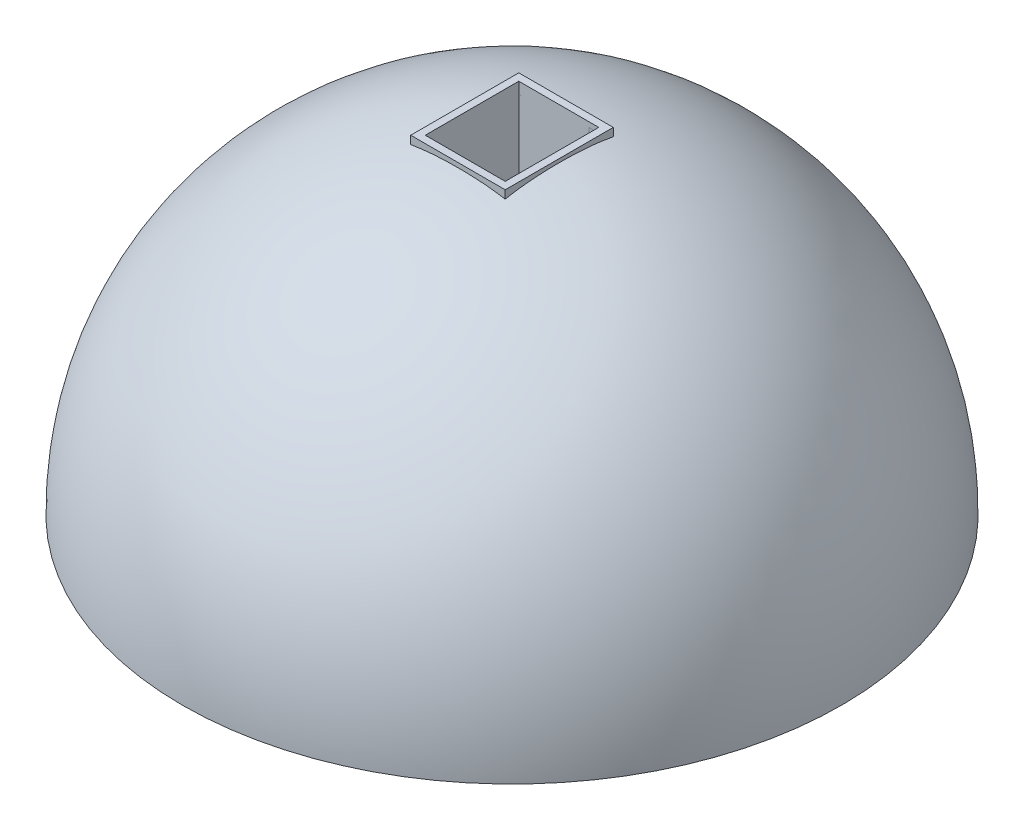
ISO-10303-21;
HEADER;
FILE_DESCRIPTION(('STEP AP214'),'2;1');
FILE_NAME('part.step','',(''),(''),'','','');
FILE_SCHEMA(('AUTOMOTIVE_DESIGN { 1 0 10303 214 1 1 1 1 }'));
ENDSEC;
DATA;
#1=APPLICATION_CONTEXT('core data for automotive mechanical design processes');
#2=APPLICATION_PROTOCOL_DEFINITION('international standard','automotive_design',2000,#1);
#3=PRODUCT_CONTEXT('',#1,'mechanical');
#4=PRODUCT('Part','Part','',(#3));
#5=PRODUCT_RELATED_PRODUCT_CATEGORY('part','',(#4));
#6=PRODUCT_DEFINITION_FORMATION('','',#4);
#7=PRODUCT_DEFINITION_CONTEXT('part definition',#1,'design');
#8=PRODUCT_DEFINITION('design','',#6,#7);
#9=PRODUCT_DEFINITION_SHAPE('','',#8);
#10=(LENGTH_UNIT() NAMED_UNIT(*) SI_UNIT(.MILLI.,.METRE.));
#11=(NAMED_UNIT(*) PLANE_ANGLE_UNIT() SI_UNIT($,.RADIAN.));
#12=(NAMED_UNIT(*) SI_UNIT($,.STERADIAN.) SOLID_ANGLE_UNIT());
#13=UNCERTAINTY_MEASURE_WITH_UNIT(LENGTH_MEASURE(1.E-05),#10,'distance_accuracy_value','');
#14=(GEOMETRIC_REPRESENTATION_CONTEXT(3) GLOBAL_UNCERTAINTY_ASSIGNED_CONTEXT((#13)) GLOBAL_UNIT_ASSIGNED_CONTEXT((#10,
#11,#12)) REPRESENTATION_CONTEXT('',''));
#15=CARTESIAN_POINT('',(0.,0.,0.));
#16=DIRECTION('',(0.,0.,1.));
#17=DIRECTION('',(1.,0.,0.));
#18=AXIS2_PLACEMENT_3D('',#15,#16,#17);
#19=CARTESIAN_POINT('',(0.,8.17806906308015,0.));
#20=DIRECTION('',(0.,1.,0.));
#21=DIRECTION('',(0.,0.,-1.));
#22=AXIS2_PLACEMENT_3D('',#19,#20,#21);
#23=SPHERICAL_SURFACE('',#22,65.5219309369199);
#24=CARTESIAN_POINT('',(-8.24999999999999,8.17806906308015,0.));
#25=DIRECTION('',(-1.,0.,0.));
#26=DIRECTION('',(0.,0.,1.));
#27=AXIS2_PLACEMENT_3D('',#24,#25,#26);
#28=CIRCLE('',#27,65.0004687190984);
#29=CARTESIAN_POINT('',(-8.24999999999999,72.458224894429,9.65));
#30=VERTEX_POINT('',#29);
#31=CARTESIAN_POINT('',(-8.24999999999999,72.458224894429,-9.65));
#32=VERTEX_POINT('',#31);
#33=EDGE_CURVE('E94',#30,#32,#28,.T.);
#34=ORIENTED_EDGE('',*,*,#33,.F.);
#35=CARTESIAN_POINT('',(0.,8.17806906308015,9.65));
#36=DIRECTION('',(0.,0.,1.));
#37=DIRECTION('',(1.,0.,0.));
#38=AXIS2_PLACEMENT_3D('',#35,#36,#37);
#39=CIRCLE('',#38,64.8074141877493);
#40=CARTESIAN_POINT('',(8.25,72.458224894429,9.65));
#41=VERTEX_POINT('',#40);
#42=EDGE_CURVE('E83',#41,#30,#39,.T.);
#43=ORIENTED_EDGE('',*,*,#42,.F.);
#44=CARTESIAN_POINT('',(8.25,8.17806906308015,0.));
#45=DIRECTION('',(1.,0.,0.));
#46=DIRECTION('',(0.,0.,-1.));
#47=AXIS2_PLACEMENT_3D('',#44,#45,#46);
#48=CIRCLE('',#47,65.0004687190984);
#49=CARTESIAN_POINT('',(8.25,72.458224894429,-9.65));
#50=VERTEX_POINT('',#49);
#51=EDGE_CURVE('E88',#50,#41,#48,.T.);
#52=ORIENTED_EDGE('',*,*,#51,.F.);
#53=CARTESIAN_POINT('',(0.,8.17806906308015,-9.65));
#54=DIRECTION('',(0.,0.,-1.));
#55=DIRECTION('',(-1.,0.,0.));
#56=AXIS2_PLACEMENT_3D('',#53,#54,#55);
#57=CIRCLE('',#56,64.8074141877493);
#58=EDGE_CURVE('E101',#32,#50,#57,.T.);
#59=ORIENTED_EDGE('',*,*,#58,.F.);
#60=EDGE_LOOP('',(#34,#43,#52,#59));
#61=FACE_BOUND('',#60,.T.);
#62=CARTESIAN_POINT('',(0.,7.61999999999997,0.));
#63=DIRECTION('',(0.,1.,0.));
#64=DIRECTION('',(0.,0.,1.));
#65=AXIS2_PLACEMENT_3D('',#62,#63,#64);
#66=CIRCLE('',#65,65.519554276745);
#67=CARTESIAN_POINT('',(0.,7.61999999999995,65.519554276745));
#68=VERTEX_POINT('',#67);
#69=EDGE_CURVE('E102',#68,#68,#66,.T.);
#70=ORIENTED_EDGE('',*,*,#69,.F.);
#71=EDGE_LOOP('',(#70));
#72=FACE_BOUND('',#71,.T.);
#73=ADVANCED_FACE('F47',(#61,#72),#23,.F.);
#74=CARTESIAN_POINT('',(0.,8.17806906308015,0.));
#75=DIRECTION('',(0.,1.,0.));
#76=DIRECTION('',(0.,0.,-1.));
#77=AXIS2_PLACEMENT_3D('',#74,#75,#76);
#78=SPHERICAL_SURFACE('',#77,68.0219309369199);
#79=CARTESIAN_POINT('',(-8.24999999999999,8.17806906308015,0.));
#80=DIRECTION('',(-1.,0.,0.));
#81=DIRECTION('',(0.,0.,1.));
#82=AXIS2_PLACEMENT_3D('',#79,#80,#81);
#83=CIRCLE('',#82,67.5197792382876);
#84=CARTESIAN_POINT('',(-8.24999999999999,75.0046961542861,-9.65));
#85=VERTEX_POINT('',#84);
#86=CARTESIAN_POINT('',(-8.24999999999999,75.0046961542861,9.65));
#87=VERTEX_POINT('',#86);
#88=EDGE_CURVE('E12',#85,#87,#83,.F.);
#89=ORIENTED_EDGE('',*,*,#88,.F.);
#90=CARTESIAN_POINT('',(0.,8.17806906308015,-9.65));
#91=DIRECTION('',(0.,0.,-1.));
#92=DIRECTION('',(-1.,0.,0.));
#93=AXIS2_PLACEMENT_3D('',#90,#91,#92);
#94=CIRCLE('',#93,67.3339482607926);
#95=CARTESIAN_POINT('',(8.25,75.0046961542861,-9.65));
#96=VERTEX_POINT('',#95);
#97=EDGE_CURVE('E54',#96,#85,#94,.F.);
#98=ORIENTED_EDGE('',*,*,#97,.F.);
#99=CARTESIAN_POINT('',(8.25,8.17806906308015,0.));
#100=DIRECTION('',(1.,0.,0.));
#101=DIRECTION('',(0.,0.,-1.));
#102=AXIS2_PLACEMENT_3D('',#99,#100,#101);
#103=CIRCLE('',#102,67.5197792382876);
#104=CARTESIAN_POINT('',(8.25,75.0046961542861,9.65));
#105=VERTEX_POINT('',#104);
#106=EDGE_CURVE('E114',#105,#96,#103,.F.);
#107=ORIENTED_EDGE('',*,*,#106,.F.);
#108=CARTESIAN_POINT('',(0.,8.17806906308015,9.65));
#109=DIRECTION('',(0.,0.,1.));
#110=DIRECTION('',(1.,0.,0.));
#111=AXIS2_PLACEMENT_3D('',#108,#109,#110);
#112=CIRCLE('',#111,67.3339482607926);
#113=EDGE_CURVE('E112',#87,#105,#112,.F.);
#114=ORIENTED_EDGE('',*,*,#113,.F.);
#115=EDGE_LOOP('',(#89,#98,#107,#114));
#116=FACE_BOUND('',#115,.T.);
#117=CARTESIAN_POINT('',(0.,7.61999999999997,0.));
#118=DIRECTION('',(0.,1.,0.));
#119=DIRECTION('',(0.,0.,1.));
#120=AXIS2_PLACEMENT_3D('',#117,#118,#119);
#121=CIRCLE('',#120,68.019641628782);
#122=CARTESIAN_POINT('',(0.,7.61999999999994,68.019641628782));
#123=VERTEX_POINT('',#122);
#124=EDGE_CURVE('E105',#123,#123,#121,.T.);
#125=ORIENTED_EDGE('',*,*,#124,.T.);
#126=EDGE_LOOP('',(#125));
#127=FACE_BOUND('',#126,.T.);
#128=ADVANCED_FACE('F124',(#116,#127),#78,.T.);
#129=CARTESIAN_POINT('',(0.,7.62,-65.519554276745));
#130=DIRECTION('',(0.,-1.,0.));
#131=DIRECTION('',(0.,0.,-1.));
#132=AXIS2_PLACEMENT_3D('',#129,#130,#131);
#133=PLANE('',#132);
#134=ORIENTED_EDGE('',*,*,#69,.T.);
#135=EDGE_LOOP('',(#134));
#136=FACE_BOUND('',#135,.T.);
#137=ORIENTED_EDGE('',*,*,#124,.F.);
#138=EDGE_LOOP('',(#137));
#139=FACE_BOUND('',#138,.T.);
#140=ADVANCED_FACE('F142',(#136,#139),#133,.T.);
#141=CARTESIAN_POINT('',(-8.24999999999999,50.8,9.65));
#142=DIRECTION('',(-1.,0.,0.));
#143=DIRECTION('',(0.,0.,1.));
#144=AXIS2_PLACEMENT_3D('',#141,#142,#143);
#145=PLANE('',#144);
#146=ORIENTED_EDGE('',*,*,#33,.T.);
#147=DIRECTION('',(0.,1.,0.));
#148=VECTOR('',#147,1.);
#149=CARTESIAN_POINT('',(-8.24999999999999,50.8,-9.65));
#150=LINE('',#149,#148);
#151=EDGE_CURVE('E89',#32,#85,#150,.T.);
#152=ORIENTED_EDGE('',*,*,#151,.T.);
#153=ORIENTED_EDGE('',*,*,#88,.T.);
#154=DIRECTION('',(0.,1.,0.));
#155=VECTOR('',#154,1.);
#156=CARTESIAN_POINT('',(-8.24999999999999,50.8,9.65));
#157=LINE('',#156,#155);
#158=EDGE_CURVE('E66',#30,#87,#157,.T.);
#159=ORIENTED_EDGE('',*,*,#158,.F.);
#160=EDGE_LOOP('',(#146,#152,#153,#159));
#161=FACE_BOUND('',#160,.T.);
#162=ADVANCED_FACE('F92',(#161),#145,.F.);
#163=CARTESIAN_POINT('',(-8.24999999999999,50.8,-9.65));
#164=DIRECTION('',(0.,0.,-1.));
#165=DIRECTION('',(-1.,0.,0.));
#166=AXIS2_PLACEMENT_3D('',#163,#164,#165);
#167=PLANE('',#166);
#168=ORIENTED_EDGE('',*,*,#58,.T.);
#169=DIRECTION('',(0.,1.,0.));
#170=VECTOR('',#169,1.);
#171=CARTESIAN_POINT('',(8.25,50.8,-9.65));
#172=LINE('',#171,#170);
#173=EDGE_CURVE('E120',#50,#96,#172,.T.);
#174=ORIENTED_EDGE('',*,*,#173,.T.);
#175=ORIENTED_EDGE('',*,*,#97,.T.);
#176=ORIENTED_EDGE('',*,*,#151,.F.);
#177=EDGE_LOOP('',(#168,#174,#175,#176));
#178=FACE_BOUND('',#177,.T.);
#179=ADVANCED_FACE('F118',(#178),#167,.F.);
#180=CARTESIAN_POINT('',(8.25,50.8,9.65));
#181=DIRECTION('',(1.,0.,0.));
#182=DIRECTION('',(0.,0.,-1.));
#183=AXIS2_PLACEMENT_3D('',#180,#181,#182);
#184=PLANE('',#183);
#185=ORIENTED_EDGE('',*,*,#51,.T.);
#186=DIRECTION('',(0.,1.,0.));
#187=VECTOR('',#186,1.);
#188=CARTESIAN_POINT('',(8.25,50.8,9.65));
#189=LINE('',#188,#187);
#190=EDGE_CURVE('E61',#41,#105,#189,.T.);
#191=ORIENTED_EDGE('',*,*,#190,.T.);
#192=ORIENTED_EDGE('',*,*,#106,.T.);
#193=ORIENTED_EDGE('',*,*,#173,.F.);
#194=EDGE_LOOP('',(#185,#191,#192,#193));
#195=FACE_BOUND('',#194,.T.);
#196=ADVANCED_FACE('F127',(#195),#184,.F.);
#197=CARTESIAN_POINT('',(-8.24999999999999,50.8,9.65));
#198=DIRECTION('',(0.,0.,1.));
#199=DIRECTION('',(1.,0.,0.));
#200=AXIS2_PLACEMENT_3D('',#197,#198,#199);
#201=PLANE('',#200);
#202=ORIENTED_EDGE('',*,*,#42,.T.);
#203=ORIENTED_EDGE('',*,*,#158,.T.);
#204=ORIENTED_EDGE('',*,*,#113,.T.);
#205=ORIENTED_EDGE('',*,*,#190,.F.);
#206=EDGE_LOOP('',(#202,#203,#204,#205));
#207=FACE_BOUND('',#206,.T.);
#208=ADVANCED_FACE('F84',(#207),#201,.F.);
#209=CLOSED_SHELL('',(#73,#128,#140,#162,#179,#196,#208));
#210=MANIFOLD_SOLID_BREP('B2',#209);
#211=CARTESIAN_POINT('',(0.,76.2,0.));
#212=DIRECTION('',(0.,1.,0.));
#213=DIRECTION('',(0.,0.,1.));
#214=AXIS2_PLACEMENT_3D('',#211,#212,#213);
#215=PLANE('',#214);
#216=DIRECTION('',(0.,0.,1.));
#217=VECTOR('',#216,1.);
#218=CARTESIAN_POINT('',(-9.74999999999999,76.2,-11.15));
#219=LINE('',#218,#217);
#220=CARTESIAN_POINT('',(-9.74999999999999,76.2,-11.15));
#221=VERTEX_POINT('',#220);
#222=CARTESIAN_POINT('',(-9.74999999999999,76.2,11.15));
#223=VERTEX_POINT('',#222);
#224=EDGE_CURVE('E297',#221,#223,#219,.T.);
#225=ORIENTED_EDGE('',*,*,#224,.T.);
#226=DIRECTION('',(1.,0.,0.));
#227=VECTOR('',#226,1.);
#228=CARTESIAN_POINT('',(-9.74999999999999,76.2,11.15));
#229=LINE('',#228,#227);
#230=CARTESIAN_POINT('',(9.75,76.2,11.15));
#231=VERTEX_POINT('',#230);
#232=EDGE_CURVE('E300',#223,#231,#229,.T.);
#233=ORIENTED_EDGE('',*,*,#232,.T.);
#234=DIRECTION('',(0.,0.,-1.));
#235=VECTOR('',#234,1.);
#236=CARTESIAN_POINT('',(9.74999999999999,76.2,-11.15));
#237=LINE('',#236,#235);
#238=CARTESIAN_POINT('',(9.74999999999999,76.2,-11.15));
#239=VERTEX_POINT('',#238);
#240=EDGE_CURVE('E303',#231,#239,#237,.T.);
#241=ORIENTED_EDGE('',*,*,#240,.T.);
#242=DIRECTION('',(-1.,0.,0.));
#243=VECTOR('',#242,1.);
#244=CARTESIAN_POINT('',(-9.74999999999999,76.2,-11.15));
#245=LINE('',#244,#243);
#246=EDGE_CURVE('E305',#239,#221,#245,.T.);
#247=ORIENTED_EDGE('',*,*,#246,.T.);
#248=EDGE_LOOP('',(#225,#233,#241,#247));
#249=FACE_BOUND('',#248,.T.);
#250=DIRECTION('',(1.,0.,0.));
#251=VECTOR('',#250,1.);
#252=CARTESIAN_POINT('',(-8.24999999999999,76.2,9.65));
#253=LINE('',#252,#251);
#254=CARTESIAN_POINT('',(-8.24999999999999,76.2,9.65));
#255=VERTEX_POINT('',#254);
#256=CARTESIAN_POINT('',(8.25,76.2,9.65));
#257=VERTEX_POINT('',#256);
#258=EDGE_CURVE('E265',#255,#257,#253,.T.);
#259=ORIENTED_EDGE('',*,*,#258,.F.);
#260=DIRECTION('',(0.,0.,1.));
#261=VECTOR('',#260,1.);
#262=CARTESIAN_POINT('',(-8.25,76.2,-9.65));
#263=LINE('',#262,#261);
#264=CARTESIAN_POINT('',(-8.25,76.2,-9.65));
#265=VERTEX_POINT('',#264);
#266=EDGE_CURVE('E257',#265,#255,#263,.T.);
#267=ORIENTED_EDGE('',*,*,#266,.F.);
#268=DIRECTION('',(-1.,0.,0.));
#269=VECTOR('',#268,1.);
#270=CARTESIAN_POINT('',(-8.25,76.2,-9.65));
#271=LINE('',#270,#269);
#272=CARTESIAN_POINT('',(8.25,76.2,-9.65));
#273=VERTEX_POINT('',#272);
#274=EDGE_CURVE('E280',#273,#265,#271,.T.);
#275=ORIENTED_EDGE('',*,*,#274,.F.);
#276=DIRECTION('',(0.,0.,-1.));
#277=VECTOR('',#276,1.);
#278=CARTESIAN_POINT('',(8.25,76.2,-9.65));
#279=LINE('',#278,#277);
#280=EDGE_CURVE('E278',#257,#273,#279,.T.);
#281=ORIENTED_EDGE('',*,*,#280,.F.);
#282=EDGE_LOOP('',(#259,#267,#275,#281));
#283=FACE_BOUND('',#282,.T.);
#284=ADVANCED_FACE('F192',(#249,#283),#215,.T.);
#285=CARTESIAN_POINT('',(0.,0.,0.));
#286=DIRECTION('',(0.,1.,0.));
#287=DIRECTION('',(0.,0.,1.));
#288=AXIS2_PLACEMENT_3D('',#285,#286,#287);
#289=PLANE('',#288);
#290=DIRECTION('',(0.,0.,1.));
#291=VECTOR('',#290,1.);
#292=CARTESIAN_POINT('',(-9.74999999999999,0.,-11.15));
#293=LINE('',#292,#291);
#294=CARTESIAN_POINT('',(-9.74999999999999,0.,-11.15));
#295=VERTEX_POINT('',#294);
#296=CARTESIAN_POINT('',(-9.74999999999999,0.,11.15));
#297=VERTEX_POINT('',#296);
#298=EDGE_CURVE('E274',#295,#297,#293,.T.);
#299=ORIENTED_EDGE('',*,*,#298,.F.);
#300=DIRECTION('',(-1.,0.,0.));
#301=VECTOR('',#300,1.);
#302=CARTESIAN_POINT('',(-9.74999999999999,0.,-11.15));
#303=LINE('',#302,#301);
#304=CARTESIAN_POINT('',(9.74999999999999,0.,-11.15));
#305=VERTEX_POINT('',#304);
#306=EDGE_CURVE('E301',#305,#295,#303,.T.);
#307=ORIENTED_EDGE('',*,*,#306,.F.);
#308=DIRECTION('',(0.,0.,-1.));
#309=VECTOR('',#308,1.);
#310=CARTESIAN_POINT('',(9.74999999999999,0.,-11.15));
#311=LINE('',#310,#309);
#312=CARTESIAN_POINT('',(9.75,0.,11.15));
#313=VERTEX_POINT('',#312);
#314=EDGE_CURVE('E312',#313,#305,#311,.T.);
#315=ORIENTED_EDGE('',*,*,#314,.F.);
#316=DIRECTION('',(1.,0.,0.));
#317=VECTOR('',#316,1.);
#318=CARTESIAN_POINT('',(-9.74999999999999,0.,11.15));
#319=LINE('',#318,#317);
#320=EDGE_CURVE('E310',#297,#313,#319,.T.);
#321=ORIENTED_EDGE('',*,*,#320,.F.);
#322=EDGE_LOOP('',(#299,#307,#315,#321));
#323=FACE_BOUND('',#322,.T.);
#324=DIRECTION('',(0.,0.,1.));
#325=VECTOR('',#324,1.);
#326=CARTESIAN_POINT('',(-8.25,0.,-9.65));
#327=LINE('',#326,#325);
#328=CARTESIAN_POINT('',(-8.25,0.,-9.65));
#329=VERTEX_POINT('',#328);
#330=CARTESIAN_POINT('',(-8.24999999999999,0.,9.65));
#331=VERTEX_POINT('',#330);
#332=EDGE_CURVE('E285',#329,#331,#327,.T.);
#333=ORIENTED_EDGE('',*,*,#332,.T.);
#334=DIRECTION('',(1.,0.,0.));
#335=VECTOR('',#334,1.);
#336=CARTESIAN_POINT('',(-8.24999999999999,0.,9.65));
#337=LINE('',#336,#335);
#338=CARTESIAN_POINT('',(8.25,0.,9.65));
#339=VERTEX_POINT('',#338);
#340=EDGE_CURVE('E272',#331,#339,#337,.T.);
#341=ORIENTED_EDGE('',*,*,#340,.T.);
#342=DIRECTION('',(0.,0.,-1.));
#343=VECTOR('',#342,1.);
#344=CARTESIAN_POINT('',(8.25,0.,-9.65));
#345=LINE('',#344,#343);
#346=CARTESIAN_POINT('',(8.25,0.,-9.65));
#347=VERTEX_POINT('',#346);
#348=EDGE_CURVE('E289',#339,#347,#345,.T.);
#349=ORIENTED_EDGE('',*,*,#348,.T.);
#350=DIRECTION('',(-1.,0.,0.));
#351=VECTOR('',#350,1.);
#352=CARTESIAN_POINT('',(-8.25,0.,-9.65));
#353=LINE('',#352,#351);
#354=EDGE_CURVE('E266',#347,#329,#353,.T.);
#355=ORIENTED_EDGE('',*,*,#354,.T.);
#356=EDGE_LOOP('',(#333,#341,#349,#355));
#357=FACE_BOUND('',#356,.T.);
#358=ADVANCED_FACE('F365',(#323,#357),#289,.F.);
#359=CARTESIAN_POINT('',(-9.74999999999999,76.2,-11.15));
#360=DIRECTION('',(1.,0.,0.));
#361=DIRECTION('',(0.,0.,-1.));
#362=AXIS2_PLACEMENT_3D('',#359,#360,#361);
#363=PLANE('',#362);
#364=ORIENTED_EDGE('',*,*,#298,.T.);
#365=DIRECTION('',(0.,-1.,0.));
#366=VECTOR('',#365,1.);
#367=CARTESIAN_POINT('',(-9.74999999999999,76.2,11.15));
#368=LINE('',#367,#366);
#369=EDGE_CURVE('E45',#223,#297,#368,.T.);
#370=ORIENTED_EDGE('',*,*,#369,.F.);
#371=ORIENTED_EDGE('',*,*,#224,.F.);
#372=DIRECTION('',(0.,-1.,0.));
#373=VECTOR('',#372,1.);
#374=CARTESIAN_POINT('',(-9.74999999999999,76.2,-11.15));
#375=LINE('',#374,#373);
#376=EDGE_CURVE('E307',#221,#295,#375,.T.);
#377=ORIENTED_EDGE('',*,*,#376,.T.);
#378=EDGE_LOOP('',(#364,#370,#371,#377));
#379=FACE_BOUND('',#378,.T.);
#380=ADVANCED_FACE('F194',(#379),#363,.F.);
#381=CARTESIAN_POINT('',(-9.74999999999999,76.2,11.15));
#382=DIRECTION('',(0.,0.,-1.));
#383=DIRECTION('',(-1.,0.,0.));
#384=AXIS2_PLACEMENT_3D('',#381,#382,#383);
#385=PLANE('',#384);
#386=ORIENTED_EDGE('',*,*,#320,.T.);
#387=DIRECTION('',(0.,-1.,0.));
#388=VECTOR('',#387,1.);
#389=CARTESIAN_POINT('',(9.75,76.2,11.15));
#390=LINE('',#389,#388);
#391=EDGE_CURVE('E201',#231,#313,#390,.T.);
#392=ORIENTED_EDGE('',*,*,#391,.F.);
#393=ORIENTED_EDGE('',*,*,#232,.F.);
#394=ORIENTED_EDGE('',*,*,#369,.T.);
#395=EDGE_LOOP('',(#386,#392,#393,#394));
#396=FACE_BOUND('',#395,.T.);
#397=ADVANCED_FACE('F352',(#396),#385,.F.);
#398=CARTESIAN_POINT('',(9.74999999999999,76.2,-11.15));
#399=DIRECTION('',(-1.,0.,0.));
#400=DIRECTION('',(0.,0.,1.));
#401=AXIS2_PLACEMENT_3D('',#398,#399,#400);
#402=PLANE('',#401);
#403=CARTESIAN_POINT('',(9.75,24.5378627889406,0.));
#404=DIRECTION('',(1.,0.,0.));
#405=DIRECTION('',(0.,0.,-1.));
#406=AXIS2_PLACEMENT_3D('',#403,#404,#405);
#407=CIRCLE('',#406,1.75);
#408=CARTESIAN_POINT('',(9.75,24.5378627889406,-1.75000000000001));
#409=VERTEX_POINT('',#408);
#410=EDGE_CURVE('E325',#409,#409,#407,.T.);
#411=ORIENTED_EDGE('',*,*,#410,.F.);
#412=EDGE_LOOP('',(#411));
#413=FACE_BOUND('',#412,.T.);
#414=CARTESIAN_POINT('',(9.75,52.0993544528044,0.));
#415=DIRECTION('',(1.,0.,0.));
#416=DIRECTION('',(0.,0.,-1.));
#417=AXIS2_PLACEMENT_3D('',#414,#415,#416);
#418=CIRCLE('',#417,1.75);
#419=CARTESIAN_POINT('',(9.75,52.0993544528044,-1.75));
#420=VERTEX_POINT('',#419);
#421=EDGE_CURVE('E333',#420,#420,#418,.T.);
#422=ORIENTED_EDGE('',*,*,#421,.F.);
#423=EDGE_LOOP('',(#422));
#424=FACE_BOUND('',#423,.T.);
#425=ORIENTED_EDGE('',*,*,#314,.T.);
#426=DIRECTION('',(0.,-1.,0.));
#427=VECTOR('',#426,1.);
#428=CARTESIAN_POINT('',(9.74999999999999,76.2,-11.15));
#429=LINE('',#428,#427);
#430=EDGE_CURVE('E317',#239,#305,#429,.T.);
#431=ORIENTED_EDGE('',*,*,#430,.F.);
#432=ORIENTED_EDGE('',*,*,#240,.F.);
#433=ORIENTED_EDGE('',*,*,#391,.T.);
#434=EDGE_LOOP('',(#425,#431,#432,#433));
#435=FACE_BOUND('',#434,.T.);
#436=ADVANCED_FACE('F348',(#413,#424,#435),#402,.F.);
#437=CARTESIAN_POINT('',(-9.74999999999999,76.2,-11.15));
#438=DIRECTION('',(0.,0.,1.));
#439=DIRECTION('',(1.,0.,0.));
#440=AXIS2_PLACEMENT_3D('',#437,#438,#439);
#441=PLANE('',#440);
#442=CARTESIAN_POINT('',(0.,15.7258273974728,-11.15));
#443=DIRECTION('',(0.,0.,-1.));
#444=DIRECTION('',(-1.,0.,0.));
#445=AXIS2_PLACEMENT_3D('',#442,#443,#444);
#446=CIRCLE('',#445,1.75);
#447=CARTESIAN_POINT('',(-1.75,15.7258273974728,-11.15));
#448=VERTEX_POINT('',#447);
#449=EDGE_CURVE('E329',#448,#448,#446,.T.);
#450=ORIENTED_EDGE('',*,*,#449,.F.);
#451=EDGE_LOOP('',(#450));
#452=FACE_BOUND('',#451,.T.);
#453=CARTESIAN_POINT('',(0.,39.1971291928004,-11.15));
#454=DIRECTION('',(0.,0.,-1.));
#455=DIRECTION('',(-1.,0.,0.));
#456=AXIS2_PLACEMENT_3D('',#453,#454,#455);
#457=CIRCLE('',#456,1.75);
#458=CARTESIAN_POINT('',(-1.75,39.1971291928004,-11.15));
#459=VERTEX_POINT('',#458);
#460=EDGE_CURVE('E335',#459,#459,#457,.T.);
#461=ORIENTED_EDGE('',*,*,#460,.F.);
#462=EDGE_LOOP('',(#461));
#463=FACE_BOUND('',#462,.T.);
#464=ORIENTED_EDGE('',*,*,#306,.T.);
#465=ORIENTED_EDGE('',*,*,#376,.F.);
#466=ORIENTED_EDGE('',*,*,#246,.F.);
#467=ORIENTED_EDGE('',*,*,#430,.T.);
#468=EDGE_LOOP('',(#464,#465,#466,#467));
#469=FACE_BOUND('',#468,.T.);
#470=ADVANCED_FACE('F351',(#452,#463,#469),#441,.F.);
#471=CARTESIAN_POINT('',(-8.25,76.2,-9.65));
#472=DIRECTION('',(1.,0.,0.));
#473=DIRECTION('',(0.,0.,-1.));
#474=AXIS2_PLACEMENT_3D('',#471,#472,#473);
#475=PLANE('',#474);
#476=ORIENTED_EDGE('',*,*,#332,.F.);
#477=DIRECTION('',(0.,-1.,0.));
#478=VECTOR('',#477,1.);
#479=CARTESIAN_POINT('',(-8.25,76.2,-9.65));
#480=LINE('',#479,#478);
#481=EDGE_CURVE('E214',#265,#329,#480,.T.);
#482=ORIENTED_EDGE('',*,*,#481,.F.);
#483=ORIENTED_EDGE('',*,*,#266,.T.);
#484=DIRECTION('',(0.,-1.,0.));
#485=VECTOR('',#484,1.);
#486=CARTESIAN_POINT('',(-8.24999999999999,76.2,9.65));
#487=LINE('',#486,#485);
#488=EDGE_CURVE('E260',#255,#331,#487,.T.);
#489=ORIENTED_EDGE('',*,*,#488,.T.);
#490=EDGE_LOOP('',(#476,#482,#483,#489));
#491=FACE_BOUND('',#490,.T.);
#492=ADVANCED_FACE('F259',(#491),#475,.T.);
#493=CARTESIAN_POINT('',(-8.24999999999999,76.2,9.65));
#494=DIRECTION('',(0.,0.,-1.));
#495=DIRECTION('',(-1.,0.,0.));
#496=AXIS2_PLACEMENT_3D('',#493,#494,#495);
#497=PLANE('',#496);
#498=ORIENTED_EDGE('',*,*,#340,.F.);
#499=ORIENTED_EDGE('',*,*,#488,.F.);
#500=ORIENTED_EDGE('',*,*,#258,.T.);
#501=DIRECTION('',(0.,-1.,0.));
#502=VECTOR('',#501,1.);
#503=CARTESIAN_POINT('',(8.25,76.2,9.65));
#504=LINE('',#503,#502);
#505=EDGE_CURVE('E275',#257,#339,#504,.T.);
#506=ORIENTED_EDGE('',*,*,#505,.T.);
#507=EDGE_LOOP('',(#498,#499,#500,#506));
#508=FACE_BOUND('',#507,.T.);
#509=ADVANCED_FACE('F269',(#508),#497,.T.);
#510=CARTESIAN_POINT('',(8.25,76.2,-9.65));
#511=DIRECTION('',(-1.,0.,0.));
#512=DIRECTION('',(0.,0.,1.));
#513=AXIS2_PLACEMENT_3D('',#510,#511,#512);
#514=PLANE('',#513);
#515=CARTESIAN_POINT('',(8.25,24.5378627889406,0.));
#516=DIRECTION('',(-1.,0.,0.));
#517=DIRECTION('',(0.,0.,1.));
#518=AXIS2_PLACEMENT_3D('',#515,#516,#517);
#519=CIRCLE('',#518,1.75);
#520=CARTESIAN_POINT('',(8.25,24.5378627889406,1.75));
#521=VERTEX_POINT('',#520);
#522=EDGE_CURVE('E287',#521,#521,#519,.T.);
#523=ORIENTED_EDGE('',*,*,#522,.F.);
#524=EDGE_LOOP('',(#523));
#525=FACE_BOUND('',#524,.T.);
#526=CARTESIAN_POINT('',(8.25,52.0993544528044,0.));
#527=DIRECTION('',(-1.,0.,0.));
#528=DIRECTION('',(0.,0.,1.));
#529=AXIS2_PLACEMENT_3D('',#526,#527,#528);
#530=CIRCLE('',#529,1.75);
#531=CARTESIAN_POINT('',(8.25,52.0993544528044,1.75));
#532=VERTEX_POINT('',#531);
#533=EDGE_CURVE('E322',#532,#532,#530,.T.);
#534=ORIENTED_EDGE('',*,*,#533,.F.);
#535=EDGE_LOOP('',(#534));
#536=FACE_BOUND('',#535,.T.);
#537=ORIENTED_EDGE('',*,*,#348,.F.);
#538=ORIENTED_EDGE('',*,*,#505,.F.);
#539=ORIENTED_EDGE('',*,*,#280,.T.);
#540=DIRECTION('',(0.,-1.,0.));
#541=VECTOR('',#540,1.);
#542=CARTESIAN_POINT('',(8.25,76.2,-9.65));
#543=LINE('',#542,#541);
#544=EDGE_CURVE('E209',#273,#347,#543,.T.);
#545=ORIENTED_EDGE('',*,*,#544,.T.);
#546=EDGE_LOOP('',(#537,#538,#539,#545));
#547=FACE_BOUND('',#546,.T.);
#548=ADVANCED_FACE('F413',(#525,#536,#547),#514,.T.);
#549=CARTESIAN_POINT('',(-8.25,76.2,-9.65));
#550=DIRECTION('',(0.,0.,1.));
#551=DIRECTION('',(1.,0.,0.));
#552=AXIS2_PLACEMENT_3D('',#549,#550,#551);
#553=PLANE('',#552);
#554=CARTESIAN_POINT('',(0.,15.7258273974728,-9.65));
#555=DIRECTION('',(0.,0.,1.));
#556=DIRECTION('',(1.,0.,0.));
#557=AXIS2_PLACEMENT_3D('',#554,#555,#556);
#558=CIRCLE('',#557,1.75);
#559=CARTESIAN_POINT('',(1.75,15.7258273974728,-9.65));
#560=VERTEX_POINT('',#559);
#561=EDGE_CURVE('E196',#560,#560,#558,.T.);
#562=ORIENTED_EDGE('',*,*,#561,.F.);
#563=EDGE_LOOP('',(#562));
#564=FACE_BOUND('',#563,.T.);
#565=CARTESIAN_POINT('',(0.,39.1971291928004,-9.65));
#566=DIRECTION('',(0.,0.,1.));
#567=DIRECTION('',(1.,0.,0.));
#568=AXIS2_PLACEMENT_3D('',#565,#566,#567);
#569=CIRCLE('',#568,1.75);
#570=CARTESIAN_POINT('',(1.75,39.1971291928004,-9.65));
#571=VERTEX_POINT('',#570);
#572=EDGE_CURVE('E327',#571,#571,#569,.T.);
#573=ORIENTED_EDGE('',*,*,#572,.F.);
#574=EDGE_LOOP('',(#573));
#575=FACE_BOUND('',#574,.T.);
#576=ORIENTED_EDGE('',*,*,#354,.F.);
#577=ORIENTED_EDGE('',*,*,#544,.F.);
#578=ORIENTED_EDGE('',*,*,#274,.T.);
#579=ORIENTED_EDGE('',*,*,#481,.T.);
#580=EDGE_LOOP('',(#576,#577,#578,#579));
#581=FACE_BOUND('',#580,.T.);
#582=ADVANCED_FACE('F409',(#564,#575,#581),#553,.T.);
#583=CARTESIAN_POINT('',(-2.95,52.0993544528044,0.));
#584=DIRECTION('',(1.,0.,0.));
#585=DIRECTION('',(0.,0.,-1.));
#586=AXIS2_PLACEMENT_3D('',#583,#584,#585);
#587=CYLINDRICAL_SURFACE('',#586,1.75);
#588=ORIENTED_EDGE('',*,*,#533,.T.);
#589=EDGE_LOOP('',(#588));
#590=FACE_BOUND('',#589,.T.);
#591=ORIENTED_EDGE('',*,*,#421,.T.);
#592=EDGE_LOOP('',(#591));
#593=FACE_BOUND('',#592,.T.);
#594=ADVANCED_FACE('F346',(#590,#593),#587,.F.);
#595=CARTESIAN_POINT('',(-2.95,24.5378627889406,0.));
#596=DIRECTION('',(1.,0.,0.));
#597=DIRECTION('',(0.,0.,-1.));
#598=AXIS2_PLACEMENT_3D('',#595,#596,#597);
#599=CYLINDRICAL_SURFACE('',#598,1.75);
#600=ORIENTED_EDGE('',*,*,#522,.T.);
#601=EDGE_LOOP('',(#600));
#602=FACE_BOUND('',#601,.T.);
#603=ORIENTED_EDGE('',*,*,#410,.T.);
#604=EDGE_LOOP('',(#603));
#605=FACE_BOUND('',#604,.T.);
#606=ADVANCED_FACE('F396',(#602,#605),#599,.F.);
#607=CARTESIAN_POINT('',(0.,39.1971291928004,1.55));
#608=DIRECTION('',(0.,0.,-1.));
#609=DIRECTION('',(-1.,0.,0.));
#610=AXIS2_PLACEMENT_3D('',#607,#608,#609);
#611=CYLINDRICAL_SURFACE('',#610,1.75);
#612=ORIENTED_EDGE('',*,*,#572,.T.);
#613=EDGE_LOOP('',(#612));
#614=FACE_BOUND('',#613,.T.);
#615=ORIENTED_EDGE('',*,*,#460,.T.);
#616=EDGE_LOOP('',(#615));
#617=FACE_BOUND('',#616,.T.);
#618=ADVANCED_FACE('F393',(#614,#617),#611,.F.);
#619=CARTESIAN_POINT('',(0.,15.7258273974728,1.55));
#620=DIRECTION('',(0.,0.,-1.));
#621=DIRECTION('',(-1.,0.,0.));
#622=AXIS2_PLACEMENT_3D('',#619,#620,#621);
#623=CYLINDRICAL_SURFACE('',#622,1.75);
#624=ORIENTED_EDGE('',*,*,#561,.T.);
#625=EDGE_LOOP('',(#624));
#626=FACE_BOUND('',#625,.T.);
#627=ORIENTED_EDGE('',*,*,#449,.T.);
#628=EDGE_LOOP('',(#627));
#629=FACE_BOUND('',#628,.T.);
#630=ADVANCED_FACE('F395',(#626,#629),#623,.F.);
#631=CLOSED_SHELL('',(#284,#358,#380,#397,#436,#470,#492,#509,#548,#582,#594,#606,#618,#630));
#632=MANIFOLD_SOLID_BREP('B6',#631);
#633=ADVANCED_BREP_SHAPE_REPRESENTATION('',(#18,#210,#632),#14);
#634=SHAPE_DEFINITION_REPRESENTATION(#9,#633);
ENDSEC;
END-ISO-10303-21;
